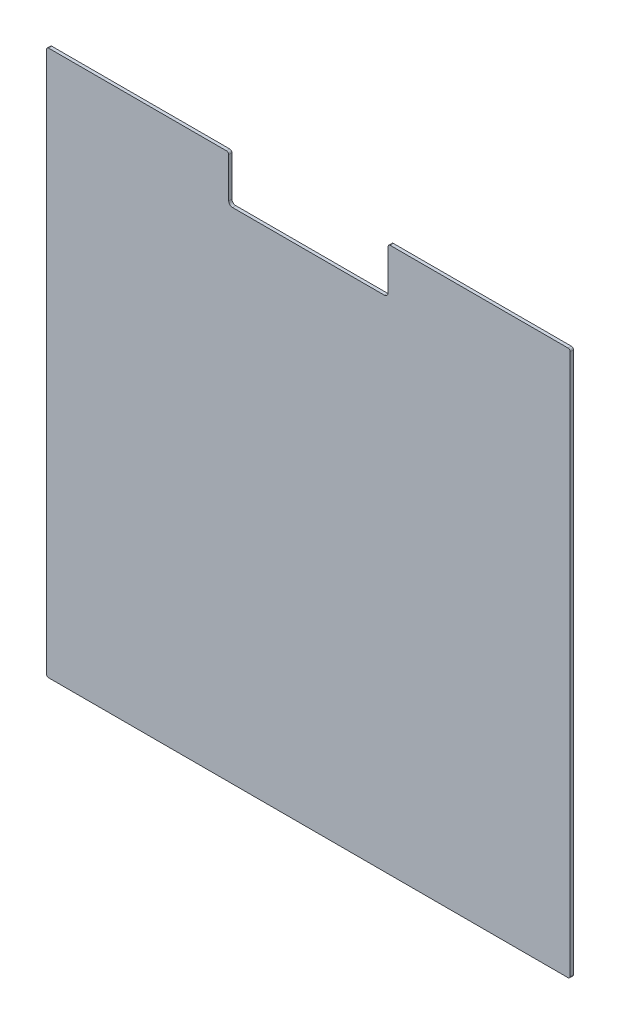
ISO-10303-21;
HEADER;
FILE_DESCRIPTION(('STEP AP214'),'2;1');
FILE_NAME('part.step','',(''),(''),'','','');
FILE_SCHEMA(('AUTOMOTIVE_DESIGN { 1 0 10303 214 1 1 1 1 }'));
ENDSEC;
DATA;
#1=APPLICATION_CONTEXT('core data for automotive mechanical design processes');
#2=APPLICATION_PROTOCOL_DEFINITION('international standard','automotive_design',2000,#1);
#3=PRODUCT_CONTEXT('',#1,'mechanical');
#4=PRODUCT('Part','Part','',(#3));
#5=PRODUCT_RELATED_PRODUCT_CATEGORY('part','',(#4));
#6=PRODUCT_DEFINITION_FORMATION('','',#4);
#7=PRODUCT_DEFINITION_CONTEXT('part definition',#1,'design');
#8=PRODUCT_DEFINITION('design','',#6,#7);
#9=PRODUCT_DEFINITION_SHAPE('','',#8);
#10=(LENGTH_UNIT() NAMED_UNIT(*) SI_UNIT(.MILLI.,.METRE.));
#11=(NAMED_UNIT(*) PLANE_ANGLE_UNIT() SI_UNIT($,.RADIAN.));
#12=(NAMED_UNIT(*) SI_UNIT($,.STERADIAN.) SOLID_ANGLE_UNIT());
#13=UNCERTAINTY_MEASURE_WITH_UNIT(LENGTH_MEASURE(1.E-05),#10,'distance_accuracy_value','');
#14=(GEOMETRIC_REPRESENTATION_CONTEXT(3) GLOBAL_UNCERTAINTY_ASSIGNED_CONTEXT((#13)) GLOBAL_UNIT_ASSIGNED_CONTEXT((#10,
#11,#12)) REPRESENTATION_CONTEXT('',''));
#15=CARTESIAN_POINT('',(0.,0.,0.));
#16=DIRECTION('',(0.,0.,1.));
#17=DIRECTION('',(1.,0.,0.));
#18=AXIS2_PLACEMENT_3D('',#15,#16,#17);
#19=CARTESIAN_POINT('',(76.4773858907142,-139.499999433756,3.));
#20=DIRECTION('',(0.,0.,-1.));
#21=DIRECTION('',(-1.,0.,0.));
#22=AXIS2_PLACEMENT_3D('',#19,#20,#21);
#23=CYLINDRICAL_SURFACE('',#22,1.99999999999998);
#24=CARTESIAN_POINT('',(76.4773858907142,-139.499999433756,0.));
#25=DIRECTION('',(0.,0.,1.));
#26=DIRECTION('',(1.,0.,0.));
#27=AXIS2_PLACEMENT_3D('',#24,#25,#26);
#28=CIRCLE('',#27,1.99999999999998);
#29=CARTESIAN_POINT('',(76.4773858907142,-141.499999433756,0.));
#30=VERTEX_POINT('',#29);
#31=CARTESIAN_POINT('',(78.4773858907142,-139.499999433756,0.));
#32=VERTEX_POINT('',#31);
#33=EDGE_CURVE('E188',#30,#32,#28,.T.);
#34=ORIENTED_EDGE('',*,*,#33,.T.);
#35=DIRECTION('',(0.,0.,-1.));
#36=VECTOR('',#35,1.);
#37=CARTESIAN_POINT('',(78.4773858907142,-139.499999433756,3.));
#38=LINE('',#37,#36);
#39=CARTESIAN_POINT('',(78.4773858907142,-139.499999433756,3.));
#40=VERTEX_POINT('',#39);
#41=EDGE_CURVE('E11',#40,#32,#38,.T.);
#42=ORIENTED_EDGE('',*,*,#41,.F.);
#43=CARTESIAN_POINT('',(76.4773858907142,-139.499999433756,3.));
#44=DIRECTION('',(0.,0.,1.));
#45=DIRECTION('',(1.,0.,0.));
#46=AXIS2_PLACEMENT_3D('',#43,#44,#45);
#47=CIRCLE('',#46,1.99999999999998);
#48=CARTESIAN_POINT('',(76.4773858907142,-141.499999433756,3.));
#49=VERTEX_POINT('',#48);
#50=EDGE_CURVE('E234',#49,#40,#47,.T.);
#51=ORIENTED_EDGE('',*,*,#50,.F.);
#52=DIRECTION('',(0.,0.,-1.));
#53=VECTOR('',#52,1.);
#54=CARTESIAN_POINT('',(76.4773858907142,-141.499999433756,3.));
#55=LINE('',#54,#53);
#56=EDGE_CURVE('E184',#49,#30,#55,.T.);
#57=ORIENTED_EDGE('',*,*,#56,.T.);
#58=EDGE_LOOP('',(#34,#42,#51,#57));
#59=FACE_BOUND('',#58,.T.);
#60=ADVANCED_FACE('F39',(#59),#23,.T.);
#61=CARTESIAN_POINT('',(78.4773858907142,359.500000476835,3.));
#62=DIRECTION('',(-1.,0.,0.));
#63=DIRECTION('',(0.,-1.,0.));
#64=AXIS2_PLACEMENT_3D('',#61,#62,#63);
#65=PLANE('',#64);
#66=DIRECTION('',(0.,1.,0.));
#67=VECTOR('',#66,1.);
#68=CARTESIAN_POINT('',(78.4773858907142,359.500000476835,0.));
#69=LINE('',#68,#67);
#70=CARTESIAN_POINT('',(78.4773858907142,359.500000476835,0.));
#71=VERTEX_POINT('',#70);
#72=EDGE_CURVE('E192',#32,#71,#69,.T.);
#73=ORIENTED_EDGE('',*,*,#72,.T.);
#74=DIRECTION('',(0.,0.,-1.));
#75=VECTOR('',#74,1.);
#76=CARTESIAN_POINT('',(78.4773858907142,359.500000476835,3.));
#77=LINE('',#76,#75);
#78=CARTESIAN_POINT('',(78.4773858907142,359.500000476835,3.));
#79=VERTEX_POINT('',#78);
#80=EDGE_CURVE('E48',#79,#71,#77,.T.);
#81=ORIENTED_EDGE('',*,*,#80,.F.);
#82=DIRECTION('',(0.,1.,0.));
#83=VECTOR('',#82,1.);
#84=CARTESIAN_POINT('',(78.4773858907142,359.500000476835,3.));
#85=LINE('',#84,#83);
#86=EDGE_CURVE('E123',#40,#79,#85,.T.);
#87=ORIENTED_EDGE('',*,*,#86,.F.);
#88=ORIENTED_EDGE('',*,*,#41,.T.);
#89=EDGE_LOOP('',(#73,#81,#87,#88));
#90=FACE_BOUND('',#89,.T.);
#91=ADVANCED_FACE('F356',(#90),#65,.F.);
#92=CARTESIAN_POINT('',(76.4773858907142,359.500000476835,3.));
#93=DIRECTION('',(0.,0.,-1.));
#94=DIRECTION('',(-1.,0.,0.));
#95=AXIS2_PLACEMENT_3D('',#92,#93,#94);
#96=CYLINDRICAL_SURFACE('',#95,2.00000000000002);
#97=CARTESIAN_POINT('',(76.4773858907142,359.500000476835,0.));
#98=DIRECTION('',(0.,0.,1.));
#99=DIRECTION('',(1.,0.,0.));
#100=AXIS2_PLACEMENT_3D('',#97,#98,#99);
#101=CIRCLE('',#100,2.00000000000002);
#102=CARTESIAN_POINT('',(76.4773858907142,361.500000476835,0.));
#103=VERTEX_POINT('',#102);
#104=EDGE_CURVE('E195',#71,#103,#101,.T.);
#105=ORIENTED_EDGE('',*,*,#104,.T.);
#106=DIRECTION('',(0.,0.,-1.));
#107=VECTOR('',#106,1.);
#108=CARTESIAN_POINT('',(76.4773858907142,361.500000476835,3.));
#109=LINE('',#108,#107);
#110=CARTESIAN_POINT('',(76.4773858907142,361.500000476835,3.));
#111=VERTEX_POINT('',#110);
#112=EDGE_CURVE('E277',#111,#103,#109,.T.);
#113=ORIENTED_EDGE('',*,*,#112,.F.);
#114=CARTESIAN_POINT('',(76.4773858907142,359.500000476835,3.));
#115=DIRECTION('',(0.,0.,1.));
#116=DIRECTION('',(1.,0.,0.));
#117=AXIS2_PLACEMENT_3D('',#114,#115,#116);
#118=CIRCLE('',#117,2.00000000000002);
#119=EDGE_CURVE('E287',#79,#111,#118,.T.);
#120=ORIENTED_EDGE('',*,*,#119,.F.);
#121=ORIENTED_EDGE('',*,*,#80,.T.);
#122=EDGE_LOOP('',(#105,#113,#120,#121));
#123=FACE_BOUND('',#122,.T.);
#124=ADVANCED_FACE('F285',(#123),#96,.T.);
#125=CARTESIAN_POINT('',(-87.4996676936114,361.500000476835,3.));
#126=DIRECTION('',(0.,-1.,0.));
#127=DIRECTION('',(0.,0.,-1.));
#128=AXIS2_PLACEMENT_3D('',#125,#126,#127);
#129=PLANE('',#128);
#130=DIRECTION('',(-1.,0.,0.));
#131=VECTOR('',#130,1.);
#132=CARTESIAN_POINT('',(-87.4996676936114,361.500000476835,0.));
#133=LINE('',#132,#131);
#134=CARTESIAN_POINT('',(-87.4996676936114,361.500000476835,0.));
#135=VERTEX_POINT('',#134);
#136=EDGE_CURVE('E198',#103,#135,#133,.T.);
#137=ORIENTED_EDGE('',*,*,#136,.T.);
#138=DIRECTION('',(0.,0.,-1.));
#139=VECTOR('',#138,1.);
#140=CARTESIAN_POINT('',(-87.4996676936114,361.500000476835,3.));
#141=LINE('',#140,#139);
#142=CARTESIAN_POINT('',(-87.4996676936114,361.500000476835,3.));
#143=VERTEX_POINT('',#142);
#144=EDGE_CURVE('E273',#143,#135,#141,.T.);
#145=ORIENTED_EDGE('',*,*,#144,.F.);
#146=DIRECTION('',(-1.,0.,0.));
#147=VECTOR('',#146,1.);
#148=CARTESIAN_POINT('',(-87.4996676936114,361.500000476835,3.));
#149=LINE('',#148,#147);
#150=EDGE_CURVE('E306',#111,#143,#149,.T.);
#151=ORIENTED_EDGE('',*,*,#150,.F.);
#152=ORIENTED_EDGE('',*,*,#112,.T.);
#153=EDGE_LOOP('',(#137,#145,#151,#152));
#154=FACE_BOUND('',#153,.T.);
#155=ADVANCED_FACE('F296',(#154),#129,.F.);
#156=CARTESIAN_POINT('',(-87.4996676936114,359.500000476835,3.));
#157=DIRECTION('',(0.,0.,-1.));
#158=DIRECTION('',(-1.,0.,0.));
#159=AXIS2_PLACEMENT_3D('',#156,#157,#158);
#160=CYLINDRICAL_SURFACE('',#159,2.00000000000002);
#161=CARTESIAN_POINT('',(-87.4996676936114,359.500000476835,0.));
#162=DIRECTION('',(0.,0.,1.));
#163=DIRECTION('',(1.,0.,0.));
#164=AXIS2_PLACEMENT_3D('',#161,#162,#163);
#165=CIRCLE('',#164,2.00000000000002);
#166=CARTESIAN_POINT('',(-89.4996676936114,359.500000476835,0.));
#167=VERTEX_POINT('',#166);
#168=EDGE_CURVE('E201',#135,#167,#165,.T.);
#169=ORIENTED_EDGE('',*,*,#168,.T.);
#170=DIRECTION('',(0.,0.,-1.));
#171=VECTOR('',#170,1.);
#172=CARTESIAN_POINT('',(-89.4996676936114,359.500000476835,3.));
#173=LINE('',#172,#171);
#174=CARTESIAN_POINT('',(-89.4996676936114,359.500000476835,3.));
#175=VERTEX_POINT('',#174);
#176=EDGE_CURVE('E269',#175,#167,#173,.T.);
#177=ORIENTED_EDGE('',*,*,#176,.F.);
#178=CARTESIAN_POINT('',(-87.4996676936114,359.500000476835,3.));
#179=DIRECTION('',(0.,0.,1.));
#180=DIRECTION('',(1.,0.,0.));
#181=AXIS2_PLACEMENT_3D('',#178,#179,#180);
#182=CIRCLE('',#181,2.00000000000002);
#183=EDGE_CURVE('E302',#143,#175,#182,.T.);
#184=ORIENTED_EDGE('',*,*,#183,.F.);
#185=ORIENTED_EDGE('',*,*,#144,.T.);
#186=EDGE_LOOP('',(#169,#177,#184,#185));
#187=FACE_BOUND('',#186,.T.);
#188=ADVANCED_FACE('F300',(#187),#160,.T.);
#189=CARTESIAN_POINT('',(-89.4996676936114,322.5,3.));
#190=DIRECTION('',(1.,0.,0.));
#191=DIRECTION('',(0.,1.,0.));
#192=AXIS2_PLACEMENT_3D('',#189,#190,#191);
#193=PLANE('',#192);
#194=DIRECTION('',(0.,-1.,0.));
#195=VECTOR('',#194,1.);
#196=CARTESIAN_POINT('',(-89.4996676936114,322.5,0.));
#197=LINE('',#196,#195);
#198=CARTESIAN_POINT('',(-89.4996676936114,322.5,0.));
#199=VERTEX_POINT('',#198);
#200=EDGE_CURVE('E204',#167,#199,#197,.T.);
#201=ORIENTED_EDGE('',*,*,#200,.T.);
#202=DIRECTION('',(0.,0.,-1.));
#203=VECTOR('',#202,1.);
#204=CARTESIAN_POINT('',(-89.4996676936114,322.5,3.));
#205=LINE('',#204,#203);
#206=CARTESIAN_POINT('',(-89.4996676936114,322.5,3.));
#207=VERTEX_POINT('',#206);
#208=EDGE_CURVE('E265',#207,#199,#205,.T.);
#209=ORIENTED_EDGE('',*,*,#208,.F.);
#210=DIRECTION('',(0.,-1.,0.));
#211=VECTOR('',#210,1.);
#212=CARTESIAN_POINT('',(-89.4996676936114,322.5,3.));
#213=LINE('',#212,#211);
#214=EDGE_CURVE('E305',#175,#207,#213,.T.);
#215=ORIENTED_EDGE('',*,*,#214,.F.);
#216=ORIENTED_EDGE('',*,*,#176,.T.);
#217=EDGE_LOOP('',(#201,#209,#215,#216));
#218=FACE_BOUND('',#217,.T.);
#219=ADVANCED_FACE('F369',(#218),#193,.F.);
#220=CARTESIAN_POINT('',(-92.9996676936114,322.5,3.));
#221=DIRECTION('',(0.,0.,-1.));
#222=DIRECTION('',(-1.,0.,0.));
#223=AXIS2_PLACEMENT_3D('',#220,#221,#222);
#224=CYLINDRICAL_SURFACE('',#223,3.5);
#225=CARTESIAN_POINT('',(-92.9996676936114,322.5,0.));
#226=DIRECTION('',(0.,0.,-1.));
#227=DIRECTION('',(1.,0.,0.));
#228=AXIS2_PLACEMENT_3D('',#225,#226,#227);
#229=CIRCLE('',#228,3.5);
#230=CARTESIAN_POINT('',(-92.9996676936114,319.,0.));
#231=VERTEX_POINT('',#230);
#232=EDGE_CURVE('E207',#199,#231,#229,.T.);
#233=ORIENTED_EDGE('',*,*,#232,.T.);
#234=DIRECTION('',(0.,0.,-1.));
#235=VECTOR('',#234,1.);
#236=CARTESIAN_POINT('',(-92.9996676936114,319.,3.));
#237=LINE('',#236,#235);
#238=CARTESIAN_POINT('',(-92.9996676936114,319.,3.));
#239=VERTEX_POINT('',#238);
#240=EDGE_CURVE('E261',#239,#231,#237,.T.);
#241=ORIENTED_EDGE('',*,*,#240,.F.);
#242=CARTESIAN_POINT('',(-92.9996676936114,322.5,3.));
#243=DIRECTION('',(0.,0.,-1.));
#244=DIRECTION('',(1.,0.,0.));
#245=AXIS2_PLACEMENT_3D('',#242,#243,#244);
#246=CIRCLE('',#245,3.5);
#247=EDGE_CURVE('E310',#207,#239,#246,.T.);
#248=ORIENTED_EDGE('',*,*,#247,.F.);
#249=ORIENTED_EDGE('',*,*,#208,.T.);
#250=EDGE_LOOP('',(#233,#241,#248,#249));
#251=FACE_BOUND('',#250,.T.);
#252=ADVANCED_FACE('F372',(#251),#224,.F.);
#253=CARTESIAN_POINT('',(-232.999667693611,319.,3.));
#254=DIRECTION('',(0.,-1.,0.));
#255=DIRECTION('',(0.,0.,-1.));
#256=AXIS2_PLACEMENT_3D('',#253,#254,#255);
#257=PLANE('',#256);
#258=DIRECTION('',(-1.,0.,0.));
#259=VECTOR('',#258,1.);
#260=CARTESIAN_POINT('',(-232.999667693611,319.,0.));
#261=LINE('',#260,#259);
#262=CARTESIAN_POINT('',(-232.999667693611,319.,0.));
#263=VERTEX_POINT('',#262);
#264=EDGE_CURVE('E210',#231,#263,#261,.T.);
#265=ORIENTED_EDGE('',*,*,#264,.T.);
#266=DIRECTION('',(0.,0.,-1.));
#267=VECTOR('',#266,1.);
#268=CARTESIAN_POINT('',(-232.999667693611,319.,3.));
#269=LINE('',#268,#267);
#270=CARTESIAN_POINT('',(-232.999667693611,319.,3.));
#271=VERTEX_POINT('',#270);
#272=EDGE_CURVE('E257',#271,#263,#269,.T.);
#273=ORIENTED_EDGE('',*,*,#272,.F.);
#274=DIRECTION('',(-1.,0.,0.));
#275=VECTOR('',#274,1.);
#276=CARTESIAN_POINT('',(-232.999667693611,319.,3.));
#277=LINE('',#276,#275);
#278=EDGE_CURVE('E317',#239,#271,#277,.T.);
#279=ORIENTED_EDGE('',*,*,#278,.F.);
#280=ORIENTED_EDGE('',*,*,#240,.T.);
#281=EDGE_LOOP('',(#265,#273,#279,#280));
#282=FACE_BOUND('',#281,.T.);
#283=ADVANCED_FACE('F376',(#282),#257,.F.);
#284=CARTESIAN_POINT('',(-232.999667693611,322.5,3.));
#285=DIRECTION('',(0.,0.,-1.));
#286=DIRECTION('',(-1.,0.,0.));
#287=AXIS2_PLACEMENT_3D('',#284,#285,#286);
#288=CYLINDRICAL_SURFACE('',#287,3.5);
#289=CARTESIAN_POINT('',(-232.999667693611,322.5,0.));
#290=DIRECTION('',(0.,0.,-1.));
#291=DIRECTION('',(1.,0.,0.));
#292=AXIS2_PLACEMENT_3D('',#289,#290,#291);
#293=CIRCLE('',#292,3.5);
#294=CARTESIAN_POINT('',(-236.499667693611,322.5,0.));
#295=VERTEX_POINT('',#294);
#296=EDGE_CURVE('E213',#263,#295,#293,.T.);
#297=ORIENTED_EDGE('',*,*,#296,.T.);
#298=DIRECTION('',(0.,0.,-1.));
#299=VECTOR('',#298,1.);
#300=CARTESIAN_POINT('',(-236.499667693611,322.5,3.));
#301=LINE('',#300,#299);
#302=CARTESIAN_POINT('',(-236.499667693611,322.5,3.));
#303=VERTEX_POINT('',#302);
#304=EDGE_CURVE('E253',#303,#295,#301,.T.);
#305=ORIENTED_EDGE('',*,*,#304,.F.);
#306=CARTESIAN_POINT('',(-232.999667693611,322.5,3.));
#307=DIRECTION('',(0.,0.,-1.));
#308=DIRECTION('',(1.,0.,0.));
#309=AXIS2_PLACEMENT_3D('',#306,#307,#308);
#310=CIRCLE('',#309,3.5);
#311=EDGE_CURVE('E320',#271,#303,#310,.T.);
#312=ORIENTED_EDGE('',*,*,#311,.F.);
#313=ORIENTED_EDGE('',*,*,#272,.T.);
#314=EDGE_LOOP('',(#297,#305,#312,#313));
#315=FACE_BOUND('',#314,.T.);
#316=ADVANCED_FACE('F380',(#315),#288,.F.);
#317=CARTESIAN_POINT('',(-236.499667693611,359.500000476835,3.));
#318=DIRECTION('',(-1.,0.,0.));
#319=DIRECTION('',(0.,-1.,0.));
#320=AXIS2_PLACEMENT_3D('',#317,#318,#319);
#321=PLANE('',#320);
#322=DIRECTION('',(0.,1.,0.));
#323=VECTOR('',#322,1.);
#324=CARTESIAN_POINT('',(-236.499667693611,359.500000476835,0.));
#325=LINE('',#324,#323);
#326=CARTESIAN_POINT('',(-236.499667693611,359.500000476835,0.));
#327=VERTEX_POINT('',#326);
#328=EDGE_CURVE('E216',#295,#327,#325,.T.);
#329=ORIENTED_EDGE('',*,*,#328,.T.);
#330=DIRECTION('',(0.,0.,-1.));
#331=VECTOR('',#330,1.);
#332=CARTESIAN_POINT('',(-236.499667693611,359.500000476835,3.));
#333=LINE('',#332,#331);
#334=CARTESIAN_POINT('',(-236.499667693611,359.500000476835,3.));
#335=VERTEX_POINT('',#334);
#336=EDGE_CURVE('E249',#335,#327,#333,.T.);
#337=ORIENTED_EDGE('',*,*,#336,.F.);
#338=DIRECTION('',(0.,1.,0.));
#339=VECTOR('',#338,1.);
#340=CARTESIAN_POINT('',(-236.499667693611,359.500000476835,3.));
#341=LINE('',#340,#339);
#342=EDGE_CURVE('E323',#303,#335,#341,.T.);
#343=ORIENTED_EDGE('',*,*,#342,.F.);
#344=ORIENTED_EDGE('',*,*,#304,.T.);
#345=EDGE_LOOP('',(#329,#337,#343,#344));
#346=FACE_BOUND('',#345,.T.);
#347=ADVANCED_FACE('F384',(#346),#321,.F.);
#348=CARTESIAN_POINT('',(-238.499667693611,359.500000476835,3.));
#349=DIRECTION('',(0.,0.,-1.));
#350=DIRECTION('',(-1.,0.,0.));
#351=AXIS2_PLACEMENT_3D('',#348,#349,#350);
#352=CYLINDRICAL_SURFACE('',#351,2.00000000000003);
#353=CARTESIAN_POINT('',(-238.499667693611,359.500000476835,0.));
#354=DIRECTION('',(0.,0.,1.));
#355=DIRECTION('',(1.,0.,0.));
#356=AXIS2_PLACEMENT_3D('',#353,#354,#355);
#357=CIRCLE('',#356,2.00000000000003);
#358=CARTESIAN_POINT('',(-238.499667693611,361.500000476835,0.));
#359=VERTEX_POINT('',#358);
#360=EDGE_CURVE('E219',#327,#359,#357,.T.);
#361=ORIENTED_EDGE('',*,*,#360,.T.);
#362=DIRECTION('',(0.,0.,-1.));
#363=VECTOR('',#362,1.);
#364=CARTESIAN_POINT('',(-238.499667693611,361.500000476835,3.));
#365=LINE('',#364,#363);
#366=CARTESIAN_POINT('',(-238.499667693611,361.500000476835,3.));
#367=VERTEX_POINT('',#366);
#368=EDGE_CURVE('E245',#367,#359,#365,.T.);
#369=ORIENTED_EDGE('',*,*,#368,.F.);
#370=CARTESIAN_POINT('',(-238.499667693611,359.500000476835,3.));
#371=DIRECTION('',(0.,0.,1.));
#372=DIRECTION('',(1.,0.,0.));
#373=AXIS2_PLACEMENT_3D('',#370,#371,#372);
#374=CIRCLE('',#373,2.00000000000003);
#375=EDGE_CURVE('E326',#335,#367,#374,.T.);
#376=ORIENTED_EDGE('',*,*,#375,.F.);
#377=ORIENTED_EDGE('',*,*,#336,.T.);
#378=EDGE_LOOP('',(#361,#369,#376,#377));
#379=FACE_BOUND('',#378,.T.);
#380=ADVANCED_FACE('F388',(#379),#352,.T.);
#381=CARTESIAN_POINT('',(-402.522614019876,361.500000476835,3.));
#382=DIRECTION('',(0.,-1.,0.));
#383=DIRECTION('',(0.,0.,-1.));
#384=AXIS2_PLACEMENT_3D('',#381,#382,#383);
#385=PLANE('',#384);
#386=DIRECTION('',(-1.,0.,0.));
#387=VECTOR('',#386,1.);
#388=CARTESIAN_POINT('',(-402.522614019876,361.500000476835,0.));
#389=LINE('',#388,#387);
#390=CARTESIAN_POINT('',(-402.522614019876,361.500000476835,0.));
#391=VERTEX_POINT('',#390);
#392=EDGE_CURVE('E222',#359,#391,#389,.T.);
#393=ORIENTED_EDGE('',*,*,#392,.T.);
#394=DIRECTION('',(0.,0.,-1.));
#395=VECTOR('',#394,1.);
#396=CARTESIAN_POINT('',(-402.522614019876,361.500000476835,3.));
#397=LINE('',#396,#395);
#398=CARTESIAN_POINT('',(-402.522614019876,361.500000476835,3.));
#399=VERTEX_POINT('',#398);
#400=EDGE_CURVE('E241',#399,#391,#397,.T.);
#401=ORIENTED_EDGE('',*,*,#400,.F.);
#402=DIRECTION('',(-1.,0.,0.));
#403=VECTOR('',#402,1.);
#404=CARTESIAN_POINT('',(-402.522614019876,361.500000476835,3.));
#405=LINE('',#404,#403);
#406=EDGE_CURVE('E329',#367,#399,#405,.T.);
#407=ORIENTED_EDGE('',*,*,#406,.F.);
#408=ORIENTED_EDGE('',*,*,#368,.T.);
#409=EDGE_LOOP('',(#393,#401,#407,#408));
#410=FACE_BOUND('',#409,.T.);
#411=ADVANCED_FACE('F337',(#410),#385,.F.);
#412=CARTESIAN_POINT('',(-402.522614019876,359.500000476835,3.));
#413=DIRECTION('',(0.,0.,-1.));
#414=DIRECTION('',(-1.,0.,0.));
#415=AXIS2_PLACEMENT_3D('',#412,#413,#414);
#416=CYLINDRICAL_SURFACE('',#415,2.00000000000009);
#417=CARTESIAN_POINT('',(-402.522614019876,359.500000476835,0.));
#418=DIRECTION('',(0.,0.,1.));
#419=DIRECTION('',(1.,0.,0.));
#420=AXIS2_PLACEMENT_3D('',#417,#418,#419);
#421=CIRCLE('',#420,2.00000000000009);
#422=CARTESIAN_POINT('',(-404.522614019876,359.500000476835,0.));
#423=VERTEX_POINT('',#422);
#424=EDGE_CURVE('E225',#391,#423,#421,.T.);
#425=ORIENTED_EDGE('',*,*,#424,.T.);
#426=DIRECTION('',(0.,0.,-1.));
#427=VECTOR('',#426,1.);
#428=CARTESIAN_POINT('',(-404.522614019876,359.500000476835,3.));
#429=LINE('',#428,#427);
#430=CARTESIAN_POINT('',(-404.522614019876,359.500000476835,3.));
#431=VERTEX_POINT('',#430);
#432=EDGE_CURVE('E177',#431,#423,#429,.T.);
#433=ORIENTED_EDGE('',*,*,#432,.F.);
#434=CARTESIAN_POINT('',(-402.522614019876,359.500000476835,3.));
#435=DIRECTION('',(0.,0.,1.));
#436=DIRECTION('',(1.,0.,0.));
#437=AXIS2_PLACEMENT_3D('',#434,#435,#436);
#438=CIRCLE('',#437,2.00000000000009);
#439=EDGE_CURVE('E166',#399,#431,#438,.T.);
#440=ORIENTED_EDGE('',*,*,#439,.F.);
#441=ORIENTED_EDGE('',*,*,#400,.T.);
#442=EDGE_LOOP('',(#425,#433,#440,#441));
#443=FACE_BOUND('',#442,.T.);
#444=ADVANCED_FACE('F341',(#443),#416,.T.);
#445=CARTESIAN_POINT('',(-404.522614019876,-139.499999433756,3.));
#446=DIRECTION('',(1.,0.,0.));
#447=DIRECTION('',(0.,0.,-1.));
#448=AXIS2_PLACEMENT_3D('',#445,#446,#447);
#449=PLANE('',#448);
#450=DIRECTION('',(0.,-1.,0.));
#451=VECTOR('',#450,1.);
#452=CARTESIAN_POINT('',(-404.522614019876,-139.499999433756,0.));
#453=LINE('',#452,#451);
#454=CARTESIAN_POINT('',(-404.522614019876,-139.499999433756,0.));
#455=VERTEX_POINT('',#454);
#456=EDGE_CURVE('E175',#423,#455,#453,.T.);
#457=ORIENTED_EDGE('',*,*,#456,.T.);
#458=DIRECTION('',(0.,0.,-1.));
#459=VECTOR('',#458,1.);
#460=CARTESIAN_POINT('',(-404.522614019876,-139.499999433756,3.));
#461=LINE('',#460,#459);
#462=CARTESIAN_POINT('',(-404.522614019876,-139.499999433756,3.));
#463=VERTEX_POINT('',#462);
#464=EDGE_CURVE('E172',#463,#455,#461,.T.);
#465=ORIENTED_EDGE('',*,*,#464,.F.);
#466=DIRECTION('',(0.,-1.,0.));
#467=VECTOR('',#466,1.);
#468=CARTESIAN_POINT('',(-404.522614019876,-139.499999433756,3.));
#469=LINE('',#468,#467);
#470=EDGE_CURVE('E160',#431,#463,#469,.T.);
#471=ORIENTED_EDGE('',*,*,#470,.F.);
#472=ORIENTED_EDGE('',*,*,#432,.T.);
#473=EDGE_LOOP('',(#457,#465,#471,#472));
#474=FACE_BOUND('',#473,.T.);
#475=ADVANCED_FACE('F173',(#474),#449,.F.);
#476=CARTESIAN_POINT('',(-402.522614019876,-139.499999433756,3.));
#477=DIRECTION('',(0.,0.,-1.));
#478=DIRECTION('',(-1.,0.,0.));
#479=AXIS2_PLACEMENT_3D('',#476,#477,#478);
#480=CYLINDRICAL_SURFACE('',#479,2.00000000000004);
#481=CARTESIAN_POINT('',(-402.522614019876,-139.499999433756,0.));
#482=DIRECTION('',(0.,0.,1.));
#483=DIRECTION('',(1.,0.,0.));
#484=AXIS2_PLACEMENT_3D('',#481,#482,#483);
#485=CIRCLE('',#484,2.00000000000004);
#486=CARTESIAN_POINT('',(-402.522614019876,-141.499999433756,0.));
#487=VERTEX_POINT('',#486);
#488=EDGE_CURVE('E109',#455,#487,#485,.T.);
#489=ORIENTED_EDGE('',*,*,#488,.T.);
#490=DIRECTION('',(0.,0.,-1.));
#491=VECTOR('',#490,1.);
#492=CARTESIAN_POINT('',(-402.522614019876,-141.499999433756,3.));
#493=LINE('',#492,#491);
#494=CARTESIAN_POINT('',(-402.522614019876,-141.499999433756,3.));
#495=VERTEX_POINT('',#494);
#496=EDGE_CURVE('E178',#495,#487,#493,.T.);
#497=ORIENTED_EDGE('',*,*,#496,.F.);
#498=CARTESIAN_POINT('',(-402.522614019876,-139.499999433756,3.));
#499=DIRECTION('',(0.,0.,1.));
#500=DIRECTION('',(1.,0.,0.));
#501=AXIS2_PLACEMENT_3D('',#498,#499,#500);
#502=CIRCLE('',#501,2.00000000000004);
#503=EDGE_CURVE('E164',#463,#495,#502,.T.);
#504=ORIENTED_EDGE('',*,*,#503,.F.);
#505=ORIENTED_EDGE('',*,*,#464,.T.);
#506=EDGE_LOOP('',(#489,#497,#504,#505));
#507=FACE_BOUND('',#506,.T.);
#508=ADVANCED_FACE('F180',(#507),#480,.T.);
#509=CARTESIAN_POINT('',(76.4773858907142,-141.499999433756,3.));
#510=DIRECTION('',(0.,1.,0.));
#511=DIRECTION('',(-1.,0.,0.));
#512=AXIS2_PLACEMENT_3D('',#509,#510,#511);
#513=PLANE('',#512);
#514=DIRECTION('',(1.,0.,0.));
#515=VECTOR('',#514,1.);
#516=CARTESIAN_POINT('',(76.4773858907142,-141.499999433756,0.));
#517=LINE('',#516,#515);
#518=EDGE_CURVE('E115',#487,#30,#517,.T.);
#519=ORIENTED_EDGE('',*,*,#518,.T.);
#520=ORIENTED_EDGE('',*,*,#56,.F.);
#521=DIRECTION('',(1.,0.,0.));
#522=VECTOR('',#521,1.);
#523=CARTESIAN_POINT('',(76.4773858907142,-141.499999433756,3.));
#524=LINE('',#523,#522);
#525=EDGE_CURVE('E56',#495,#49,#524,.T.);
#526=ORIENTED_EDGE('',*,*,#525,.F.);
#527=ORIENTED_EDGE('',*,*,#496,.T.);
#528=EDGE_LOOP('',(#519,#520,#526,#527));
#529=FACE_BOUND('',#528,.T.);
#530=ADVANCED_FACE('F345',(#529),#513,.F.);
#531=CARTESIAN_POINT('',(76.4773858907142,-139.499999433756,3.));
#532=DIRECTION('',(0.,0.,1.));
#533=DIRECTION('',(1.,0.,0.));
#534=AXIS2_PLACEMENT_3D('',#531,#532,#533);
#535=PLANE('',#534);
#536=ORIENTED_EDGE('',*,*,#50,.T.);
#537=ORIENTED_EDGE('',*,*,#86,.T.);
#538=ORIENTED_EDGE('',*,*,#119,.T.);
#539=ORIENTED_EDGE('',*,*,#150,.T.);
#540=ORIENTED_EDGE('',*,*,#183,.T.);
#541=ORIENTED_EDGE('',*,*,#214,.T.);
#542=ORIENTED_EDGE('',*,*,#247,.T.);
#543=ORIENTED_EDGE('',*,*,#278,.T.);
#544=ORIENTED_EDGE('',*,*,#311,.T.);
#545=ORIENTED_EDGE('',*,*,#342,.T.);
#546=ORIENTED_EDGE('',*,*,#375,.T.);
#547=ORIENTED_EDGE('',*,*,#406,.T.);
#548=ORIENTED_EDGE('',*,*,#439,.T.);
#549=ORIENTED_EDGE('',*,*,#470,.T.);
#550=ORIENTED_EDGE('',*,*,#503,.T.);
#551=ORIENTED_EDGE('',*,*,#525,.T.);
#552=EDGE_LOOP('',(#536,#537,#538,#539,#540,#541,#542,#543,#544,#545,#546,#547,#548,#549,#550,#551));
#553=FACE_BOUND('',#552,.T.);
#554=ADVANCED_FACE('F162',(#553),#535,.T.);
#555=CARTESIAN_POINT('',(76.4773858907142,-139.499999433756,0.));
#556=DIRECTION('',(0.,0.,1.));
#557=DIRECTION('',(1.,0.,0.));
#558=AXIS2_PLACEMENT_3D('',#555,#556,#557);
#559=PLANE('',#558);
#560=ORIENTED_EDGE('',*,*,#33,.F.);
#561=ORIENTED_EDGE('',*,*,#518,.F.);
#562=ORIENTED_EDGE('',*,*,#488,.F.);
#563=ORIENTED_EDGE('',*,*,#456,.F.);
#564=ORIENTED_EDGE('',*,*,#424,.F.);
#565=ORIENTED_EDGE('',*,*,#392,.F.);
#566=ORIENTED_EDGE('',*,*,#360,.F.);
#567=ORIENTED_EDGE('',*,*,#328,.F.);
#568=ORIENTED_EDGE('',*,*,#296,.F.);
#569=ORIENTED_EDGE('',*,*,#264,.F.);
#570=ORIENTED_EDGE('',*,*,#232,.F.);
#571=ORIENTED_EDGE('',*,*,#200,.F.);
#572=ORIENTED_EDGE('',*,*,#168,.F.);
#573=ORIENTED_EDGE('',*,*,#136,.F.);
#574=ORIENTED_EDGE('',*,*,#104,.F.);
#575=ORIENTED_EDGE('',*,*,#72,.F.);
#576=EDGE_LOOP('',(#560,#561,#562,#563,#564,#565,#566,#567,#568,#569,#570,#571,#572,#573,#574,#575));
#577=FACE_BOUND('',#576,.T.);
#578=ADVANCED_FACE('F291',(#577),#559,.F.);
#579=CLOSED_SHELL('',(#60,#91,#124,#155,#188,#219,#252,#283,#316,#347,#380,#411,#444,#475,#508,
#530,#554,#578));
#580=MANIFOLD_SOLID_BREP('B2',#579);
#581=ADVANCED_BREP_SHAPE_REPRESENTATION('',(#18,#580),#14);
#582=SHAPE_DEFINITION_REPRESENTATION(#9,#581);
ENDSEC;
END-ISO-10303-21;
